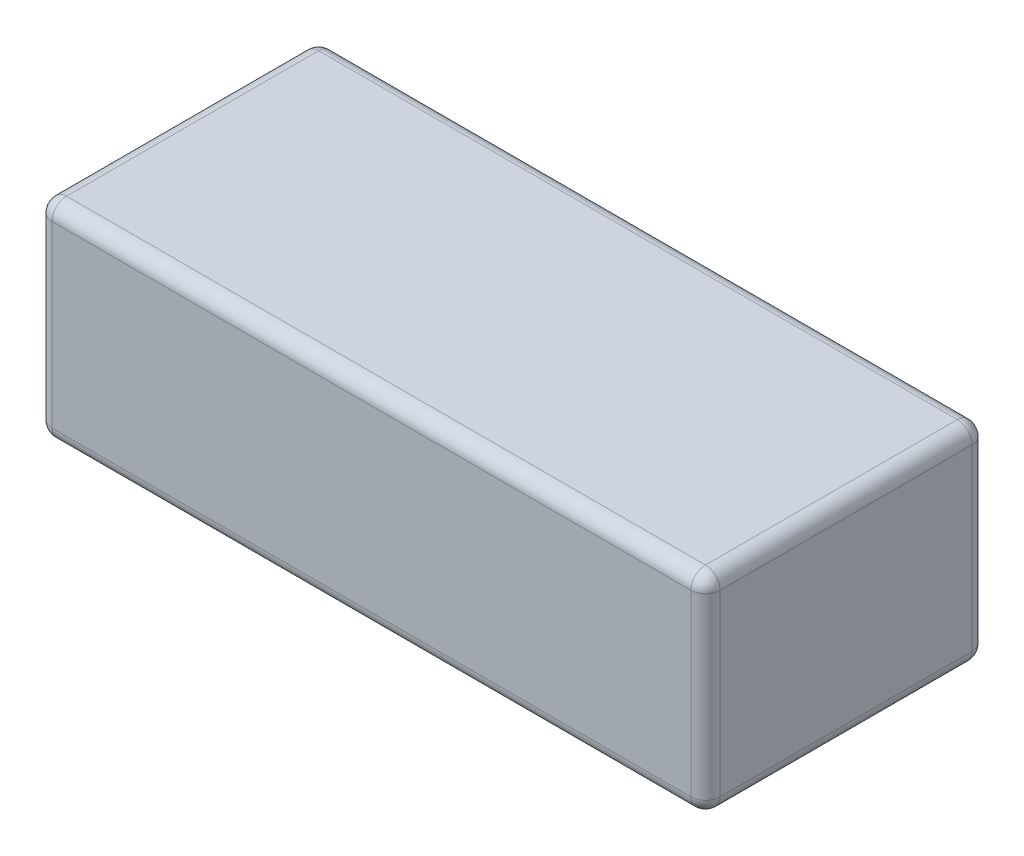
ISO-10303-21;
HEADER;
FILE_DESCRIPTION(('STEP AP214'),'2;1');
FILE_NAME('part.step','',(''),(''),'','','');
FILE_SCHEMA(('AUTOMOTIVE_DESIGN { 1 0 10303 214 1 1 1 1 }'));
ENDSEC;
DATA;
#1=APPLICATION_CONTEXT('core data for automotive mechanical design processes');
#2=APPLICATION_PROTOCOL_DEFINITION('international standard','automotive_design',2000,#1);
#3=PRODUCT_CONTEXT('',#1,'mechanical');
#4=PRODUCT('Part','Part','',(#3));
#5=PRODUCT_RELATED_PRODUCT_CATEGORY('part','',(#4));
#6=PRODUCT_DEFINITION_FORMATION('','',#4);
#7=PRODUCT_DEFINITION_CONTEXT('part definition',#1,'design');
#8=PRODUCT_DEFINITION('design','',#6,#7);
#9=PRODUCT_DEFINITION_SHAPE('','',#8);
#10=(LENGTH_UNIT() NAMED_UNIT(*) SI_UNIT(.MILLI.,.METRE.));
#11=(NAMED_UNIT(*) PLANE_ANGLE_UNIT() SI_UNIT($,.RADIAN.));
#12=(NAMED_UNIT(*) SI_UNIT($,.STERADIAN.) SOLID_ANGLE_UNIT());
#13=UNCERTAINTY_MEASURE_WITH_UNIT(LENGTH_MEASURE(1.E-05),#10,'distance_accuracy_value','');
#14=(GEOMETRIC_REPRESENTATION_CONTEXT(3) GLOBAL_UNCERTAINTY_ASSIGNED_CONTEXT((#13)) GLOBAL_UNIT_ASSIGNED_CONTEXT((#10,
#11,#12)) REPRESENTATION_CONTEXT('',''));
#15=CARTESIAN_POINT('',(0.,0.,0.));
#16=DIRECTION('',(0.,0.,1.));
#17=DIRECTION('',(1.,0.,0.));
#18=AXIS2_PLACEMENT_3D('',#15,#16,#17);
#19=CARTESIAN_POINT('',(-197.218045112782,57.,-62.6052631578947));
#20=DIRECTION('',(1.,0.,0.));
#21=DIRECTION('',(0.,0.,-1.));
#22=AXIS2_PLACEMENT_3D('',#19,#20,#21);
#23=PLANE('',#22);
#24=DIRECTION('',(0.,-1.,0.));
#25=VECTOR('',#24,1.);
#26=CARTESIAN_POINT('',(-197.218045112782,57.,-58.6052631578947));
#27=LINE('',#26,#25);
#28=CARTESIAN_POINT('',(-197.218045112782,53.,-58.6052631578947));
#29=VERTEX_POINT('',#28);
#30=CARTESIAN_POINT('',(-197.218045112782,4.,-58.6052631578947));
#31=VERTEX_POINT('',#30);
#32=EDGE_CURVE('E198',#29,#31,#27,.T.);
#33=ORIENTED_EDGE('',*,*,#32,.T.);
#34=DIRECTION('',(0.,0.,1.));
#35=VECTOR('',#34,1.);
#36=CARTESIAN_POINT('',(-197.218045112782,4.,-62.6052631578947));
#37=LINE('',#36,#35);
#38=CARTESIAN_POINT('',(-197.218045112782,4.,10.3947368421053));
#39=VERTEX_POINT('',#38);
#40=EDGE_CURVE('E205',#31,#39,#37,.T.);
#41=ORIENTED_EDGE('',*,*,#40,.T.);
#42=DIRECTION('',(0.,-1.,0.));
#43=VECTOR('',#42,1.);
#44=CARTESIAN_POINT('',(-197.218045112782,57.,10.3947368421053));
#45=LINE('',#44,#43);
#46=CARTESIAN_POINT('',(-197.218045112782,53.,10.3947368421053));
#47=VERTEX_POINT('',#46);
#48=EDGE_CURVE('E201',#39,#47,#45,.F.);
#49=ORIENTED_EDGE('',*,*,#48,.T.);
#50=DIRECTION('',(0.,0.,1.));
#51=VECTOR('',#50,1.);
#52=CARTESIAN_POINT('',(-197.218045112782,53.,-62.6052631578947));
#53=LINE('',#52,#51);
#54=EDGE_CURVE('E195',#47,#29,#53,.F.);
#55=ORIENTED_EDGE('',*,*,#54,.T.);
#56=EDGE_LOOP('',(#33,#41,#49,#55));
#57=FACE_BOUND('',#56,.T.);
#58=ADVANCED_FACE('F40',(#57),#23,.F.);
#59=CARTESIAN_POINT('',(-197.218045112782,57.,14.3947368421053));
#60=DIRECTION('',(0.,0.,-1.));
#61=DIRECTION('',(-1.,0.,0.));
#62=AXIS2_PLACEMENT_3D('',#59,#60,#61);
#63=PLANE('',#62);
#64=DIRECTION('',(0.,-1.,0.));
#65=VECTOR('',#64,1.);
#66=CARTESIAN_POINT('',(-193.218045112782,57.,14.3947368421053));
#67=LINE('',#66,#65);
#68=CARTESIAN_POINT('',(-193.218045112782,53.,14.3947368421053));
#69=VERTEX_POINT('',#68);
#70=CARTESIAN_POINT('',(-193.218045112782,4.,14.3947368421053));
#71=VERTEX_POINT('',#70);
#72=EDGE_CURVE('E185',#69,#71,#67,.T.);
#73=ORIENTED_EDGE('',*,*,#72,.T.);
#74=DIRECTION('',(1.,0.,0.));
#75=VECTOR('',#74,1.);
#76=CARTESIAN_POINT('',(-197.218045112782,4.,14.3947368421053));
#77=LINE('',#76,#75);
#78=CARTESIAN_POINT('',(-18.2180451127819,4.,14.3947368421053));
#79=VERTEX_POINT('',#78);
#80=EDGE_CURVE('E192',#71,#79,#77,.T.);
#81=ORIENTED_EDGE('',*,*,#80,.T.);
#82=DIRECTION('',(0.,-1.,0.));
#83=VECTOR('',#82,1.);
#84=CARTESIAN_POINT('',(-18.2180451127819,57.,14.3947368421053));
#85=LINE('',#84,#83);
#86=CARTESIAN_POINT('',(-18.2180451127819,53.,14.3947368421053));
#87=VERTEX_POINT('',#86);
#88=EDGE_CURVE('E188',#79,#87,#85,.F.);
#89=ORIENTED_EDGE('',*,*,#88,.T.);
#90=DIRECTION('',(1.,0.,0.));
#91=VECTOR('',#90,1.);
#92=CARTESIAN_POINT('',(-197.218045112782,53.,14.3947368421053));
#93=LINE('',#92,#91);
#94=EDGE_CURVE('E182',#87,#69,#93,.F.);
#95=ORIENTED_EDGE('',*,*,#94,.T.);
#96=EDGE_LOOP('',(#73,#81,#89,#95));
#97=FACE_BOUND('',#96,.T.);
#98=ADVANCED_FACE('F363',(#97),#63,.F.);
#99=CARTESIAN_POINT('',(-14.2180451127819,57.,-62.6052631578947));
#100=DIRECTION('',(-1.,0.,0.));
#101=DIRECTION('',(0.,0.,1.));
#102=AXIS2_PLACEMENT_3D('',#99,#100,#101);
#103=PLANE('',#102);
#104=DIRECTION('',(0.,-1.,0.));
#105=VECTOR('',#104,1.);
#106=CARTESIAN_POINT('',(-14.2180451127819,57.,10.3947368421053));
#107=LINE('',#106,#105);
#108=CARTESIAN_POINT('',(-14.2180451127819,53.,10.3947368421053));
#109=VERTEX_POINT('',#108);
#110=CARTESIAN_POINT('',(-14.2180451127819,4.,10.3947368421053));
#111=VERTEX_POINT('',#110);
#112=EDGE_CURVE('E141',#109,#111,#107,.T.);
#113=ORIENTED_EDGE('',*,*,#112,.T.);
#114=DIRECTION('',(0.,0.,-1.));
#115=VECTOR('',#114,1.);
#116=CARTESIAN_POINT('',(-14.2180451127819,4.,-62.6052631578947));
#117=LINE('',#116,#115);
#118=CARTESIAN_POINT('',(-14.2180451127819,4.,-58.6052631578947));
#119=VERTEX_POINT('',#118);
#120=EDGE_CURVE('E136',#111,#119,#117,.T.);
#121=ORIENTED_EDGE('',*,*,#120,.T.);
#122=DIRECTION('',(0.,-1.,0.));
#123=VECTOR('',#122,1.);
#124=CARTESIAN_POINT('',(-14.2180451127819,57.,-58.6052631578947));
#125=LINE('',#124,#123);
#126=CARTESIAN_POINT('',(-14.2180451127819,53.,-58.6052631578947));
#127=VERTEX_POINT('',#126);
#128=EDGE_CURVE('E128',#119,#127,#125,.F.);
#129=ORIENTED_EDGE('',*,*,#128,.T.);
#130=DIRECTION('',(0.,0.,-1.));
#131=VECTOR('',#130,1.);
#132=CARTESIAN_POINT('',(-14.2180451127819,53.,14.3947368421053));
#133=LINE('',#132,#131);
#134=EDGE_CURVE('E133',#127,#109,#133,.F.);
#135=ORIENTED_EDGE('',*,*,#134,.T.);
#136=EDGE_LOOP('',(#113,#121,#129,#135));
#137=FACE_BOUND('',#136,.T.);
#138=ADVANCED_FACE('F131',(#137),#103,.F.);
#139=CARTESIAN_POINT('',(-197.218045112782,57.,-62.6052631578947));
#140=DIRECTION('',(0.,0.,1.));
#141=DIRECTION('',(1.,0.,0.));
#142=AXIS2_PLACEMENT_3D('',#139,#140,#141);
#143=PLANE('',#142);
#144=DIRECTION('',(0.,-1.,0.));
#145=VECTOR('',#144,1.);
#146=CARTESIAN_POINT('',(-18.218045112782,57.,-62.6052631578947));
#147=LINE('',#146,#145);
#148=CARTESIAN_POINT('',(-18.218045112782,53.,-62.6052631578947));
#149=VERTEX_POINT('',#148);
#150=CARTESIAN_POINT('',(-18.218045112782,4.,-62.6052631578947));
#151=VERTEX_POINT('',#150);
#152=EDGE_CURVE('E149',#149,#151,#147,.T.);
#153=ORIENTED_EDGE('',*,*,#152,.T.);
#154=DIRECTION('',(-1.,0.,0.));
#155=VECTOR('',#154,1.);
#156=CARTESIAN_POINT('',(-197.218045112782,4.,-62.6052631578947));
#157=LINE('',#156,#155);
#158=CARTESIAN_POINT('',(-193.218045112782,4.,-62.6052631578947));
#159=VERTEX_POINT('',#158);
#160=EDGE_CURVE('E216',#151,#159,#157,.T.);
#161=ORIENTED_EDGE('',*,*,#160,.T.);
#162=DIRECTION('',(0.,-1.,0.));
#163=VECTOR('',#162,1.);
#164=CARTESIAN_POINT('',(-193.218045112782,57.,-62.6052631578947));
#165=LINE('',#164,#163);
#166=CARTESIAN_POINT('',(-193.218045112782,53.,-62.6052631578947));
#167=VERTEX_POINT('',#166);
#168=EDGE_CURVE('E211',#159,#167,#165,.F.);
#169=ORIENTED_EDGE('',*,*,#168,.T.);
#170=DIRECTION('',(-1.,0.,0.));
#171=VECTOR('',#170,1.);
#172=CARTESIAN_POINT('',(-14.2180451127819,53.,-62.6052631578947));
#173=LINE('',#172,#171);
#174=EDGE_CURVE('E208',#167,#149,#173,.F.);
#175=ORIENTED_EDGE('',*,*,#174,.T.);
#176=EDGE_LOOP('',(#153,#161,#169,#175));
#177=FACE_BOUND('',#176,.T.);
#178=ADVANCED_FACE('F354',(#177),#143,.F.);
#179=CARTESIAN_POINT('',(0.,57.,0.));
#180=DIRECTION('',(0.,1.,0.));
#181=DIRECTION('',(0.,0.,1.));
#182=AXIS2_PLACEMENT_3D('',#179,#180,#181);
#183=PLANE('',#182);
#184=DIRECTION('',(0.,0.,-1.));
#185=VECTOR('',#184,1.);
#186=CARTESIAN_POINT('',(-18.2180451127819,57.,-62.6052631578947));
#187=LINE('',#186,#185);
#188=CARTESIAN_POINT('',(-18.2180451127819,57.,10.3947368421053));
#189=VERTEX_POINT('',#188);
#190=CARTESIAN_POINT('',(-18.2180451127819,57.,-58.6052631578947));
#191=VERTEX_POINT('',#190);
#192=EDGE_CURVE('E50',#189,#191,#187,.T.);
#193=ORIENTED_EDGE('',*,*,#192,.T.);
#194=DIRECTION('',(-1.,0.,0.));
#195=VECTOR('',#194,1.);
#196=CARTESIAN_POINT('',(-197.218045112782,57.,-58.6052631578947));
#197=LINE('',#196,#195);
#198=CARTESIAN_POINT('',(-193.218045112782,57.,-58.6052631578947));
#199=VERTEX_POINT('',#198);
#200=EDGE_CURVE('E11',#191,#199,#197,.T.);
#201=ORIENTED_EDGE('',*,*,#200,.T.);
#202=DIRECTION('',(0.,0.,1.));
#203=VECTOR('',#202,1.);
#204=CARTESIAN_POINT('',(-193.218045112782,57.,14.3947368421053));
#205=LINE('',#204,#203);
#206=CARTESIAN_POINT('',(-193.218045112782,57.,10.3947368421053));
#207=VERTEX_POINT('',#206);
#208=EDGE_CURVE('E232',#199,#207,#205,.T.);
#209=ORIENTED_EDGE('',*,*,#208,.T.);
#210=DIRECTION('',(1.,0.,0.));
#211=VECTOR('',#210,1.);
#212=CARTESIAN_POINT('',(-14.2180451127819,57.,10.3947368421053));
#213=LINE('',#212,#211);
#214=EDGE_CURVE('E61',#207,#189,#213,.T.);
#215=ORIENTED_EDGE('',*,*,#214,.T.);
#216=EDGE_LOOP('',(#193,#201,#209,#215));
#217=FACE_BOUND('',#216,.T.);
#218=ADVANCED_FACE('F356',(#217),#183,.T.);
#219=CARTESIAN_POINT('',(0.,0.,0.));
#220=DIRECTION('',(0.,1.,0.));
#221=DIRECTION('',(0.,0.,1.));
#222=AXIS2_PLACEMENT_3D('',#219,#220,#221);
#223=PLANE('',#222);
#224=DIRECTION('',(0.,0.,-1.));
#225=VECTOR('',#224,1.);
#226=CARTESIAN_POINT('',(-18.2180451127819,0.,0.));
#227=LINE('',#226,#225);
#228=CARTESIAN_POINT('',(-18.2180451127819,0.,-58.6052631578947));
#229=VERTEX_POINT('',#228);
#230=CARTESIAN_POINT('',(-18.2180451127819,0.,10.3947368421053));
#231=VERTEX_POINT('',#230);
#232=EDGE_CURVE('E225',#229,#231,#227,.F.);
#233=ORIENTED_EDGE('',*,*,#232,.T.);
#234=DIRECTION('',(1.,0.,0.));
#235=VECTOR('',#234,1.);
#236=CARTESIAN_POINT('',(0.,0.,10.3947368421053));
#237=LINE('',#236,#235);
#238=CARTESIAN_POINT('',(-193.218045112782,0.,10.3947368421053));
#239=VERTEX_POINT('',#238);
#240=EDGE_CURVE('E228',#231,#239,#237,.F.);
#241=ORIENTED_EDGE('',*,*,#240,.T.);
#242=DIRECTION('',(0.,0.,1.));
#243=VECTOR('',#242,1.);
#244=CARTESIAN_POINT('',(-193.218045112782,0.,0.));
#245=LINE('',#244,#243);
#246=CARTESIAN_POINT('',(-193.218045112782,0.,-58.6052631578947));
#247=VERTEX_POINT('',#246);
#248=EDGE_CURVE('E219',#239,#247,#245,.F.);
#249=ORIENTED_EDGE('',*,*,#248,.T.);
#250=DIRECTION('',(-1.,0.,0.));
#251=VECTOR('',#250,1.);
#252=CARTESIAN_POINT('',(0.,0.,-58.6052631578947));
#253=LINE('',#252,#251);
#254=EDGE_CURVE('E222',#247,#229,#253,.F.);
#255=ORIENTED_EDGE('',*,*,#254,.T.);
#256=EDGE_LOOP('',(#233,#241,#249,#255));
#257=FACE_BOUND('',#256,.T.);
#258=ADVANCED_FACE('F324',(#257),#223,.F.);
#259=CARTESIAN_POINT('',(-193.218045112782,57.,-58.6052631578947));
#260=DIRECTION('',(0.,-1.,0.));
#261=DIRECTION('',(0.,0.,-1.));
#262=AXIS2_PLACEMENT_3D('',#259,#260,#261);
#263=CYLINDRICAL_SURFACE('',#262,4.);
#264=CARTESIAN_POINT('',(-193.218045112782,53.,-58.6052631578947));
#265=DIRECTION('',(0.,1.,0.));
#266=DIRECTION('',(0.,0.,1.));
#267=AXIS2_PLACEMENT_3D('',#264,#265,#266);
#268=CIRCLE('',#267,4.);
#269=EDGE_CURVE('E44',#167,#29,#268,.T.);
#270=ORIENTED_EDGE('',*,*,#269,.F.);
#271=ORIENTED_EDGE('',*,*,#168,.F.);
#272=CARTESIAN_POINT('',(-193.218045112782,4.,-58.6052631578947));
#273=DIRECTION('',(0.,-1.,0.));
#274=DIRECTION('',(0.,0.,-1.));
#275=AXIS2_PLACEMENT_3D('',#272,#273,#274);
#276=CIRCLE('',#275,4.);
#277=EDGE_CURVE('E173',#31,#159,#276,.T.);
#278=ORIENTED_EDGE('',*,*,#277,.F.);
#279=ORIENTED_EDGE('',*,*,#32,.F.);
#280=EDGE_LOOP('',(#270,#271,#278,#279));
#281=FACE_BOUND('',#280,.T.);
#282=ADVANCED_FACE('F42',(#281),#263,.T.);
#283=CARTESIAN_POINT('',(-193.218045112782,53.,-58.6052631578947));
#284=DIRECTION('',(0.,0.,1.));
#285=DIRECTION('',(1.,0.,0.));
#286=AXIS2_PLACEMENT_3D('',#283,#284,#285);
#287=SPHERICAL_SURFACE('',#286,4.);
#288=CARTESIAN_POINT('',(-193.218045112782,53.,-58.6052631578947));
#289=DIRECTION('',(-1.,0.,0.));
#290=DIRECTION('',(0.,0.,1.));
#291=AXIS2_PLACEMENT_3D('',#288,#289,#290);
#292=CIRCLE('',#291,4.);
#293=EDGE_CURVE('E299',#167,#199,#292,.F.);
#294=ORIENTED_EDGE('',*,*,#293,.F.);
#295=ORIENTED_EDGE('',*,*,#269,.T.);
#296=CARTESIAN_POINT('',(-193.218045112782,53.,-58.6052631578947));
#297=DIRECTION('',(0.,0.,-1.));
#298=DIRECTION('',(-1.,0.,0.));
#299=AXIS2_PLACEMENT_3D('',#296,#297,#298);
#300=CIRCLE('',#299,4.);
#301=EDGE_CURVE('E303',#199,#29,#300,.F.);
#302=ORIENTED_EDGE('',*,*,#301,.F.);
#303=EDGE_LOOP('',(#294,#295,#302));
#304=FACE_BOUND('',#303,.T.);
#305=ADVANCED_FACE('F349',(#304),#287,.T.);
#306=CARTESIAN_POINT('',(-193.218045112782,4.,-58.6052631578947));
#307=DIRECTION('',(0.,0.,1.));
#308=DIRECTION('',(1.,0.,0.));
#309=AXIS2_PLACEMENT_3D('',#306,#307,#308);
#310=SPHERICAL_SURFACE('',#309,4.);
#311=CARTESIAN_POINT('',(-193.218045112782,4.,-58.6052631578947));
#312=DIRECTION('',(0.,0.,-1.));
#313=DIRECTION('',(-1.,0.,0.));
#314=AXIS2_PLACEMENT_3D('',#311,#312,#313);
#315=CIRCLE('',#314,4.);
#316=EDGE_CURVE('E291',#31,#247,#315,.F.);
#317=ORIENTED_EDGE('',*,*,#316,.F.);
#318=ORIENTED_EDGE('',*,*,#277,.T.);
#319=CARTESIAN_POINT('',(-193.218045112782,4.,-58.6052631578947));
#320=DIRECTION('',(-1.,0.,0.));
#321=DIRECTION('',(0.,0.,1.));
#322=AXIS2_PLACEMENT_3D('',#319,#320,#321);
#323=CIRCLE('',#322,4.);
#324=EDGE_CURVE('E295',#247,#159,#323,.F.);
#325=ORIENTED_EDGE('',*,*,#324,.F.);
#326=EDGE_LOOP('',(#317,#318,#325));
#327=FACE_BOUND('',#326,.T.);
#328=ADVANCED_FACE('F312',(#327),#310,.T.);
#329=CARTESIAN_POINT('',(-193.218045112782,53.,0.));
#330=DIRECTION('',(0.,0.,-1.));
#331=DIRECTION('',(-1.,0.,0.));
#332=AXIS2_PLACEMENT_3D('',#329,#330,#331);
#333=CYLINDRICAL_SURFACE('',#332,4.);
#334=ORIENTED_EDGE('',*,*,#301,.T.);
#335=ORIENTED_EDGE('',*,*,#54,.F.);
#336=CARTESIAN_POINT('',(-193.218045112782,53.,10.3947368421053));
#337=DIRECTION('',(0.,0.,1.));
#338=DIRECTION('',(1.,0.,0.));
#339=AXIS2_PLACEMENT_3D('',#336,#337,#338);
#340=CIRCLE('',#339,4.);
#341=EDGE_CURVE('E284',#207,#47,#340,.T.);
#342=ORIENTED_EDGE('',*,*,#341,.F.);
#343=ORIENTED_EDGE('',*,*,#208,.F.);
#344=EDGE_LOOP('',(#334,#335,#342,#343));
#345=FACE_BOUND('',#344,.T.);
#346=ADVANCED_FACE('F344',(#345),#333,.T.);
#347=CARTESIAN_POINT('',(0.,53.,-58.6052631578947));
#348=DIRECTION('',(1.,0.,0.));
#349=DIRECTION('',(0.,0.,-1.));
#350=AXIS2_PLACEMENT_3D('',#347,#348,#349);
#351=CYLINDRICAL_SURFACE('',#350,4.);
#352=ORIENTED_EDGE('',*,*,#293,.T.);
#353=ORIENTED_EDGE('',*,*,#200,.F.);
#354=CARTESIAN_POINT('',(-18.218045112782,53.,-58.6052631578947));
#355=DIRECTION('',(1.,0.,0.));
#356=DIRECTION('',(0.,1.,0.));
#357=AXIS2_PLACEMENT_3D('',#354,#355,#356);
#358=CIRCLE('',#357,4.);
#359=EDGE_CURVE('E154',#149,#191,#358,.T.);
#360=ORIENTED_EDGE('',*,*,#359,.F.);
#361=ORIENTED_EDGE('',*,*,#174,.F.);
#362=EDGE_LOOP('',(#352,#353,#360,#361));
#363=FACE_BOUND('',#362,.T.);
#364=ADVANCED_FACE('F352',(#363),#351,.T.);
#365=CARTESIAN_POINT('',(-18.218045112782,57.,-58.6052631578947));
#366=DIRECTION('',(0.,-1.,0.));
#367=DIRECTION('',(0.,0.,-1.));
#368=AXIS2_PLACEMENT_3D('',#365,#366,#367);
#369=CYLINDRICAL_SURFACE('',#368,4.);
#370=CARTESIAN_POINT('',(-18.218045112782,4.,-58.6052631578947));
#371=DIRECTION('',(0.,-1.,0.));
#372=DIRECTION('',(0.,0.,-1.));
#373=AXIS2_PLACEMENT_3D('',#370,#371,#372);
#374=CIRCLE('',#373,4.);
#375=EDGE_CURVE('E155',#151,#119,#374,.T.);
#376=ORIENTED_EDGE('',*,*,#375,.F.);
#377=ORIENTED_EDGE('',*,*,#152,.F.);
#378=CARTESIAN_POINT('',(-18.2180451127819,53.,-58.6052631578947));
#379=DIRECTION('',(0.,1.,0.));
#380=DIRECTION('',(0.,0.,1.));
#381=AXIS2_PLACEMENT_3D('',#378,#379,#380);
#382=CIRCLE('',#381,4.);
#383=EDGE_CURVE('E145',#127,#149,#382,.T.);
#384=ORIENTED_EDGE('',*,*,#383,.F.);
#385=ORIENTED_EDGE('',*,*,#128,.F.);
#386=EDGE_LOOP('',(#376,#377,#384,#385));
#387=FACE_BOUND('',#386,.T.);
#388=ADVANCED_FACE('F147',(#387),#369,.T.);
#389=CARTESIAN_POINT('',(-197.218045112782,4.,-58.6052631578947));
#390=DIRECTION('',(-1.,0.,0.));
#391=DIRECTION('',(0.,0.,1.));
#392=AXIS2_PLACEMENT_3D('',#389,#390,#391);
#393=CYLINDRICAL_SURFACE('',#392,4.);
#394=ORIENTED_EDGE('',*,*,#324,.T.);
#395=ORIENTED_EDGE('',*,*,#160,.F.);
#396=CARTESIAN_POINT('',(-18.2180451127819,4.,-58.6052631578947));
#397=DIRECTION('',(1.,0.,0.));
#398=DIRECTION('',(0.,0.,-1.));
#399=AXIS2_PLACEMENT_3D('',#396,#397,#398);
#400=CIRCLE('',#399,4.);
#401=EDGE_CURVE('E277',#229,#151,#400,.T.);
#402=ORIENTED_EDGE('',*,*,#401,.F.);
#403=ORIENTED_EDGE('',*,*,#254,.F.);
#404=EDGE_LOOP('',(#394,#395,#402,#403));
#405=FACE_BOUND('',#404,.T.);
#406=ADVANCED_FACE('F320',(#405),#393,.T.);
#407=CARTESIAN_POINT('',(-193.218045112782,4.,-62.6052631578947));
#408=DIRECTION('',(0.,0.,1.));
#409=DIRECTION('',(1.,0.,0.));
#410=AXIS2_PLACEMENT_3D('',#407,#408,#409);
#411=CYLINDRICAL_SURFACE('',#410,4.);
#412=ORIENTED_EDGE('',*,*,#316,.T.);
#413=ORIENTED_EDGE('',*,*,#248,.F.);
#414=CARTESIAN_POINT('',(-193.218045112782,4.,10.3947368421053));
#415=DIRECTION('',(0.,0.,1.));
#416=DIRECTION('',(1.,0.,0.));
#417=AXIS2_PLACEMENT_3D('',#414,#415,#416);
#418=CIRCLE('',#417,4.);
#419=EDGE_CURVE('E273',#39,#239,#418,.T.);
#420=ORIENTED_EDGE('',*,*,#419,.F.);
#421=ORIENTED_EDGE('',*,*,#40,.F.);
#422=EDGE_LOOP('',(#412,#413,#420,#421));
#423=FACE_BOUND('',#422,.T.);
#424=ADVANCED_FACE('F330',(#423),#411,.T.);
#425=CARTESIAN_POINT('',(-193.218045112782,57.,10.3947368421053));
#426=DIRECTION('',(0.,-1.,0.));
#427=DIRECTION('',(0.,0.,-1.));
#428=AXIS2_PLACEMENT_3D('',#425,#426,#427);
#429=CYLINDRICAL_SURFACE('',#428,4.);
#430=CARTESIAN_POINT('',(-193.218045112782,53.,10.3947368421053));
#431=DIRECTION('',(0.,1.,0.));
#432=DIRECTION('',(0.,0.,1.));
#433=AXIS2_PLACEMENT_3D('',#430,#431,#432);
#434=CIRCLE('',#433,4.);
#435=EDGE_CURVE('E287',#47,#69,#434,.T.);
#436=ORIENTED_EDGE('',*,*,#435,.F.);
#437=ORIENTED_EDGE('',*,*,#48,.F.);
#438=CARTESIAN_POINT('',(-193.218045112782,4.,10.3947368421053));
#439=DIRECTION('',(0.,-1.,0.));
#440=DIRECTION('',(0.,0.,-1.));
#441=AXIS2_PLACEMENT_3D('',#438,#439,#440);
#442=CIRCLE('',#441,4.);
#443=EDGE_CURVE('E269',#71,#39,#442,.T.);
#444=ORIENTED_EDGE('',*,*,#443,.F.);
#445=ORIENTED_EDGE('',*,*,#72,.F.);
#446=EDGE_LOOP('',(#436,#437,#444,#445));
#447=FACE_BOUND('',#446,.T.);
#448=ADVANCED_FACE('F336',(#447),#429,.T.);
#449=CARTESIAN_POINT('',(-193.218045112782,53.,10.3947368421053));
#450=DIRECTION('',(0.,0.,1.));
#451=DIRECTION('',(1.,0.,0.));
#452=AXIS2_PLACEMENT_3D('',#449,#450,#451);
#453=SPHERICAL_SURFACE('',#452,4.);
#454=ORIENTED_EDGE('',*,*,#341,.T.);
#455=ORIENTED_EDGE('',*,*,#435,.T.);
#456=CARTESIAN_POINT('',(-193.218045112782,53.,10.3947368421053));
#457=DIRECTION('',(-1.,0.,0.));
#458=DIRECTION('',(0.,0.,1.));
#459=AXIS2_PLACEMENT_3D('',#456,#457,#458);
#460=CIRCLE('',#459,4.);
#461=EDGE_CURVE('E162',#207,#69,#460,.F.);
#462=ORIENTED_EDGE('',*,*,#461,.F.);
#463=EDGE_LOOP('',(#454,#455,#462));
#464=FACE_BOUND('',#463,.T.);
#465=ADVANCED_FACE('F410',(#464),#453,.T.);
#466=CARTESIAN_POINT('',(-18.2180451127819,53.,-58.6052631578947));
#467=DIRECTION('',(0.,0.,1.));
#468=DIRECTION('',(1.,0.,0.));
#469=AXIS2_PLACEMENT_3D('',#466,#467,#468);
#470=SPHERICAL_SURFACE('',#469,4.);
#471=ORIENTED_EDGE('',*,*,#383,.T.);
#472=ORIENTED_EDGE('',*,*,#359,.T.);
#473=CARTESIAN_POINT('',(-18.2180451127819,53.,-58.6052631578947));
#474=DIRECTION('',(0.,0.,-1.));
#475=DIRECTION('',(-1.,0.,0.));
#476=AXIS2_PLACEMENT_3D('',#473,#474,#475);
#477=CIRCLE('',#476,4.);
#478=EDGE_CURVE('E158',#127,#191,#477,.F.);
#479=ORIENTED_EDGE('',*,*,#478,.F.);
#480=EDGE_LOOP('',(#471,#472,#479));
#481=FACE_BOUND('',#480,.T.);
#482=ADVANCED_FACE('F159',(#481),#470,.T.);
#483=CARTESIAN_POINT('',(-18.2180451127819,4.,-58.6052631578947));
#484=DIRECTION('',(0.,0.,1.));
#485=DIRECTION('',(1.,0.,0.));
#486=AXIS2_PLACEMENT_3D('',#483,#484,#485);
#487=SPHERICAL_SURFACE('',#486,4.);
#488=ORIENTED_EDGE('',*,*,#401,.T.);
#489=ORIENTED_EDGE('',*,*,#375,.T.);
#490=CARTESIAN_POINT('',(-18.2180451127819,4.,-58.6052631578947));
#491=DIRECTION('',(0.,0.,-1.));
#492=DIRECTION('',(-1.,0.,0.));
#493=AXIS2_PLACEMENT_3D('',#490,#491,#492);
#494=CIRCLE('',#493,4.);
#495=EDGE_CURVE('E163',#229,#119,#494,.F.);
#496=ORIENTED_EDGE('',*,*,#495,.F.);
#497=EDGE_LOOP('',(#488,#489,#496));
#498=FACE_BOUND('',#497,.T.);
#499=ADVANCED_FACE('F403',(#498),#487,.T.);
#500=CARTESIAN_POINT('',(-193.218045112782,4.,10.3947368421053));
#501=DIRECTION('',(0.,0.,1.));
#502=DIRECTION('',(1.,0.,0.));
#503=AXIS2_PLACEMENT_3D('',#500,#501,#502);
#504=SPHERICAL_SURFACE('',#503,4.);
#505=ORIENTED_EDGE('',*,*,#443,.T.);
#506=ORIENTED_EDGE('',*,*,#419,.T.);
#507=CARTESIAN_POINT('',(-193.218045112782,4.,10.3947368421053));
#508=DIRECTION('',(-1.,0.,0.));
#509=DIRECTION('',(0.,0.,1.));
#510=AXIS2_PLACEMENT_3D('',#507,#508,#509);
#511=CIRCLE('',#510,4.);
#512=EDGE_CURVE('E260',#71,#239,#511,.F.);
#513=ORIENTED_EDGE('',*,*,#512,.F.);
#514=EDGE_LOOP('',(#505,#506,#513));
#515=FACE_BOUND('',#514,.T.);
#516=ADVANCED_FACE('F399',(#515),#504,.T.);
#517=CARTESIAN_POINT('',(0.,53.,10.3947368421053));
#518=DIRECTION('',(-1.,0.,0.));
#519=DIRECTION('',(0.,0.,1.));
#520=AXIS2_PLACEMENT_3D('',#517,#518,#519);
#521=CYLINDRICAL_SURFACE('',#520,4.);
#522=ORIENTED_EDGE('',*,*,#461,.T.);
#523=ORIENTED_EDGE('',*,*,#94,.F.);
#524=CARTESIAN_POINT('',(-18.2180451127819,53.,10.3947368421053));
#525=DIRECTION('',(1.,0.,0.));
#526=DIRECTION('',(0.,0.,-1.));
#527=AXIS2_PLACEMENT_3D('',#524,#525,#526);
#528=CIRCLE('',#527,4.);
#529=EDGE_CURVE('E256',#189,#87,#528,.T.);
#530=ORIENTED_EDGE('',*,*,#529,.F.);
#531=ORIENTED_EDGE('',*,*,#214,.F.);
#532=EDGE_LOOP('',(#522,#523,#530,#531));
#533=FACE_BOUND('',#532,.T.);
#534=ADVANCED_FACE('F396',(#533),#521,.T.);
#535=CARTESIAN_POINT('',(-18.2180451127819,53.,0.));
#536=DIRECTION('',(0.,0.,1.));
#537=DIRECTION('',(1.,0.,0.));
#538=AXIS2_PLACEMENT_3D('',#535,#536,#537);
#539=CYLINDRICAL_SURFACE('',#538,4.);
#540=ORIENTED_EDGE('',*,*,#478,.T.);
#541=ORIENTED_EDGE('',*,*,#192,.F.);
#542=CARTESIAN_POINT('',(-18.2180451127819,53.,10.3947368421053));
#543=DIRECTION('',(0.,0.,1.));
#544=DIRECTION('',(0.,-1.,0.));
#545=AXIS2_PLACEMENT_3D('',#542,#543,#544);
#546=CIRCLE('',#545,4.);
#547=EDGE_CURVE('E167',#109,#189,#546,.T.);
#548=ORIENTED_EDGE('',*,*,#547,.F.);
#549=ORIENTED_EDGE('',*,*,#134,.F.);
#550=EDGE_LOOP('',(#540,#541,#548,#549));
#551=FACE_BOUND('',#550,.T.);
#552=ADVANCED_FACE('F165',(#551),#539,.T.);
#553=CARTESIAN_POINT('',(-18.2180451127819,4.,-62.6052631578947));
#554=DIRECTION('',(0.,0.,-1.));
#555=DIRECTION('',(-1.,0.,0.));
#556=AXIS2_PLACEMENT_3D('',#553,#554,#555);
#557=CYLINDRICAL_SURFACE('',#556,4.);
#558=ORIENTED_EDGE('',*,*,#495,.T.);
#559=ORIENTED_EDGE('',*,*,#120,.F.);
#560=CARTESIAN_POINT('',(-18.2180451127819,4.,10.3947368421053));
#561=DIRECTION('',(0.,0.,1.));
#562=DIRECTION('',(1.,0.,0.));
#563=AXIS2_PLACEMENT_3D('',#560,#561,#562);
#564=CIRCLE('',#563,4.);
#565=EDGE_CURVE('E250',#231,#111,#564,.T.);
#566=ORIENTED_EDGE('',*,*,#565,.F.);
#567=ORIENTED_EDGE('',*,*,#232,.F.);
#568=EDGE_LOOP('',(#558,#559,#566,#567));
#569=FACE_BOUND('',#568,.T.);
#570=ADVANCED_FACE('F389',(#569),#557,.T.);
#571=CARTESIAN_POINT('',(-197.218045112782,4.,10.3947368421053));
#572=DIRECTION('',(1.,0.,0.));
#573=DIRECTION('',(0.,0.,-1.));
#574=AXIS2_PLACEMENT_3D('',#571,#572,#573);
#575=CYLINDRICAL_SURFACE('',#574,4.);
#576=ORIENTED_EDGE('',*,*,#512,.T.);
#577=ORIENTED_EDGE('',*,*,#240,.F.);
#578=CARTESIAN_POINT('',(-18.2180451127819,4.,10.3947368421053));
#579=DIRECTION('',(1.,0.,0.));
#580=DIRECTION('',(0.,0.,-1.));
#581=AXIS2_PLACEMENT_3D('',#578,#579,#580);
#582=CIRCLE('',#581,4.);
#583=EDGE_CURVE('E246',#79,#231,#582,.T.);
#584=ORIENTED_EDGE('',*,*,#583,.F.);
#585=ORIENTED_EDGE('',*,*,#80,.F.);
#586=EDGE_LOOP('',(#576,#577,#584,#585));
#587=FACE_BOUND('',#586,.T.);
#588=ADVANCED_FACE('F385',(#587),#575,.T.);
#589=CARTESIAN_POINT('',(-18.2180451127819,53.,10.3947368421053));
#590=DIRECTION('',(0.,0.,1.));
#591=DIRECTION('',(1.,0.,0.));
#592=AXIS2_PLACEMENT_3D('',#589,#590,#591);
#593=SPHERICAL_SURFACE('',#592,4.);
#594=ORIENTED_EDGE('',*,*,#547,.T.);
#595=ORIENTED_EDGE('',*,*,#529,.T.);
#596=CARTESIAN_POINT('',(-18.2180451127819,53.,10.3947368421053));
#597=DIRECTION('',(0.,1.,0.));
#598=DIRECTION('',(0.,0.,1.));
#599=AXIS2_PLACEMENT_3D('',#596,#597,#598);
#600=CIRCLE('',#599,4.);
#601=EDGE_CURVE('E242',#109,#87,#600,.F.);
#602=ORIENTED_EDGE('',*,*,#601,.F.);
#603=EDGE_LOOP('',(#594,#595,#602));
#604=FACE_BOUND('',#603,.T.);
#605=ADVANCED_FACE('F381',(#604),#593,.T.);
#606=CARTESIAN_POINT('',(-18.2180451127819,4.,10.3947368421053));
#607=DIRECTION('',(0.,0.,1.));
#608=DIRECTION('',(1.,0.,0.));
#609=AXIS2_PLACEMENT_3D('',#606,#607,#608);
#610=SPHERICAL_SURFACE('',#609,4.);
#611=ORIENTED_EDGE('',*,*,#583,.T.);
#612=ORIENTED_EDGE('',*,*,#565,.T.);
#613=CARTESIAN_POINT('',(-18.2180451127819,4.,10.3947368421053));
#614=DIRECTION('',(0.,-1.,0.));
#615=DIRECTION('',(0.,0.,-1.));
#616=AXIS2_PLACEMENT_3D('',#613,#614,#615);
#617=CIRCLE('',#616,4.);
#618=EDGE_CURVE('E239',#79,#111,#617,.F.);
#619=ORIENTED_EDGE('',*,*,#618,.F.);
#620=EDGE_LOOP('',(#611,#612,#619));
#621=FACE_BOUND('',#620,.T.);
#622=ADVANCED_FACE('F377',(#621),#610,.T.);
#623=CARTESIAN_POINT('',(-18.2180451127819,57.,10.3947368421053));
#624=DIRECTION('',(0.,-1.,0.));
#625=DIRECTION('',(0.,0.,-1.));
#626=AXIS2_PLACEMENT_3D('',#623,#624,#625);
#627=CYLINDRICAL_SURFACE('',#626,4.);
#628=ORIENTED_EDGE('',*,*,#601,.T.);
#629=ORIENTED_EDGE('',*,*,#88,.F.);
#630=ORIENTED_EDGE('',*,*,#618,.T.);
#631=ORIENTED_EDGE('',*,*,#112,.F.);
#632=EDGE_LOOP('',(#628,#629,#630,#631));
#633=FACE_BOUND('',#632,.T.);
#634=ADVANCED_FACE('F374',(#633),#627,.T.);
#635=CLOSED_SHELL('',(#58,#98,#138,#178,#218,#258,#282,#305,#328,#346,#364,#388,#406,#424,#448,
#465,#482,#499,#516,#534,#552,#570,#588,#605,#622,#634));
#636=CARTESIAN_POINT('',(-63.7180451127819,29.2539914996155,-25.3916586871838));
#637=DIRECTION('',(-1.,0.,0.));
#638=DIRECTION('',(0.,0.,1.));
#639=AXIS2_PLACEMENT_3D('',#636,#637,#638);
#640=CYLINDRICAL_SURFACE('',#639,19.259927960524);
#641=CARTESIAN_POINT('',(-63.7180451127819,29.2539914996155,-25.3916586871838));
#642=DIRECTION('',(1.,0.,0.));
#643=DIRECTION('',(0.,0.,-1.));
#644=AXIS2_PLACEMENT_3D('',#641,#642,#643);
#645=CIRCLE('',#644,19.259927960524);
#646=CARTESIAN_POINT('',(-63.7180451127819,29.2539914996155,-6.13173072665987));
#647=VERTEX_POINT('',#646);
#648=EDGE_CURVE('E243',#647,#647,#645,.T.);
#649=CARTESIAN_POINT('',(-147.718045112782,29.2539914996155,-25.3916586871838));
#650=DIRECTION('',(1.,0.,0.));
#651=DIRECTION('',(0.,0.,-1.));
#652=AXIS2_PLACEMENT_3D('',#649,#650,#651);
#653=CIRCLE('',#652,19.259927960524);
#654=CARTESIAN_POINT('',(-147.718045112782,29.2539914996155,-6.13173072665987));
#655=VERTEX_POINT('',#654);
#656=EDGE_CURVE('E175',#655,#655,#653,.T.);
#657=CARTESIAN_POINT('',(-63.7180451127819,29.2539914996155,-6.13173072665987));
#658=CARTESIAN_POINT('',(-64.5930451127819,29.2539914996155,-6.13173072665987));
#659=CARTESIAN_POINT('',(-65.4680451127819,29.2539914996155,-6.13173072665987));
#660=CARTESIAN_POINT('',(-67.2180451127819,29.2539914996155,-6.13173072665987));
#661=CARTESIAN_POINT('',(-68.0930451127819,29.2539914996155,-6.13173072665987));
#662=CARTESIAN_POINT('',(-69.8430451127819,29.2539914996155,-6.13173072665987));
#663=CARTESIAN_POINT('',(-70.7180451127819,29.2539914996155,-6.13173072665987));
#664=CARTESIAN_POINT('',(-72.468045112782,29.2539914996155,-6.13173072665987));
#665=CARTESIAN_POINT('',(-73.343045112782,29.2539914996155,-6.13173072665987));
#666=CARTESIAN_POINT('',(-75.093045112782,29.2539914996155,-6.13173072665987));
#667=CARTESIAN_POINT('',(-75.968045112782,29.2539914996155,-6.13173072665987));
#668=CARTESIAN_POINT('',(-77.718045112782,29.2539914996155,-6.13173072665987));
#669=CARTESIAN_POINT('',(-78.5930451127819,29.2539914996155,-6.13173072665987));
#670=CARTESIAN_POINT('',(-80.3430451127819,29.2539914996155,-6.13173072665987));
#671=CARTESIAN_POINT('',(-81.2180451127819,29.2539914996155,-6.13173072665987));
#672=CARTESIAN_POINT('',(-82.9680451127819,29.2539914996155,-6.13173072665987));
#673=CARTESIAN_POINT('',(-83.8430451127819,29.2539914996155,-6.13173072665987));
#674=CARTESIAN_POINT('',(-85.5930451127819,29.2539914996155,-6.13173072665987));
#675=CARTESIAN_POINT('',(-86.4680451127819,29.2539914996155,-6.13173072665987));
#676=CARTESIAN_POINT('',(-88.218045112782,29.2539914996155,-6.13173072665987));
#677=CARTESIAN_POINT('',(-89.093045112782,29.2539914996155,-6.13173072665987));
#678=CARTESIAN_POINT('',(-90.843045112782,29.2539914996155,-6.13173072665987));
#679=CARTESIAN_POINT('',(-91.718045112782,29.2539914996155,-6.13173072665987));
#680=CARTESIAN_POINT('',(-93.468045112782,29.2539914996155,-6.13173072665987));
#681=CARTESIAN_POINT('',(-94.343045112782,29.2539914996155,-6.13173072665987));
#682=CARTESIAN_POINT('',(-96.093045112782,29.2539914996155,-6.13173072665987));
#683=CARTESIAN_POINT('',(-96.9680451127819,29.2539914996155,-6.13173072665987));
#684=CARTESIAN_POINT('',(-98.7180451127819,29.2539914996155,-6.13173072665987));
#685=CARTESIAN_POINT('',(-99.5930451127819,29.2539914996155,-6.13173072665987));
#686=CARTESIAN_POINT('',(-101.343045112782,29.2539914996155,-6.13173072665987));
#687=CARTESIAN_POINT('',(-102.218045112782,29.2539914996155,-6.13173072665987));
#688=CARTESIAN_POINT('',(-103.968045112782,29.2539914996155,-6.13173072665987));
#689=CARTESIAN_POINT('',(-104.843045112782,29.2539914996155,-6.13173072665987));
#690=CARTESIAN_POINT('',(-106.593045112782,29.2539914996155,-6.13173072665987));
#691=CARTESIAN_POINT('',(-107.468045112782,29.2539914996155,-6.13173072665987));
#692=CARTESIAN_POINT('',(-109.218045112782,29.2539914996155,-6.13173072665987));
#693=CARTESIAN_POINT('',(-110.093045112782,29.2539914996155,-6.13173072665987));
#694=CARTESIAN_POINT('',(-111.843045112782,29.2539914996155,-6.13173072665987));
#695=CARTESIAN_POINT('',(-112.718045112782,29.2539914996155,-6.13173072665987));
#696=CARTESIAN_POINT('',(-114.468045112782,29.2539914996155,-6.13173072665987));
#697=CARTESIAN_POINT('',(-115.343045112782,29.2539914996155,-6.13173072665987));
#698=CARTESIAN_POINT('',(-117.093045112782,29.2539914996155,-6.13173072665987));
#699=CARTESIAN_POINT('',(-117.968045112782,29.2539914996155,-6.13173072665987));
#700=CARTESIAN_POINT('',(-119.718045112782,29.2539914996155,-6.13173072665987));
#701=CARTESIAN_POINT('',(-120.593045112782,29.2539914996155,-6.13173072665987));
#702=CARTESIAN_POINT('',(-122.343045112782,29.2539914996155,-6.13173072665987));
#703=CARTESIAN_POINT('',(-123.218045112782,29.2539914996155,-6.13173072665987));
#704=CARTESIAN_POINT('',(-124.968045112782,29.2539914996155,-6.13173072665987));
#705=CARTESIAN_POINT('',(-125.843045112782,29.2539914996155,-6.13173072665987));
#706=CARTESIAN_POINT('',(-127.593045112782,29.2539914996155,-6.13173072665987));
#707=CARTESIAN_POINT('',(-128.468045112782,29.2539914996155,-6.13173072665987));
#708=CARTESIAN_POINT('',(-130.218045112782,29.2539914996155,-6.13173072665987));
#709=CARTESIAN_POINT('',(-131.093045112782,29.2539914996155,-6.13173072665987));
#710=CARTESIAN_POINT('',(-132.843045112782,29.2539914996155,-6.13173072665987));
#711=CARTESIAN_POINT('',(-133.718045112782,29.2539914996155,-6.13173072665987));
#712=CARTESIAN_POINT('',(-135.468045112782,29.2539914996155,-6.13173072665987));
#713=CARTESIAN_POINT('',(-136.343045112782,29.2539914996155,-6.13173072665987));
#714=CARTESIAN_POINT('',(-138.093045112782,29.2539914996155,-6.13173072665987));
#715=CARTESIAN_POINT('',(-138.968045112782,29.2539914996155,-6.13173072665987));
#716=CARTESIAN_POINT('',(-140.718045112782,29.2539914996155,-6.13173072665987));
#717=CARTESIAN_POINT('',(-141.593045112782,29.2539914996155,-6.13173072665987));
#718=CARTESIAN_POINT('',(-143.343045112782,29.2539914996155,-6.13173072665987));
#719=CARTESIAN_POINT('',(-144.218045112782,29.2539914996155,-6.13173072665987));
#720=CARTESIAN_POINT('',(-145.968045112782,29.2539914996155,-6.13173072665987));
#721=CARTESIAN_POINT('',(-146.843045112782,29.2539914996155,-6.13173072665987));
#722=CARTESIAN_POINT('',(-147.718045112782,29.2539914996155,-6.13173072665987));
#723=B_SPLINE_CURVE_WITH_KNOTS('',3,(#657,#658,#659,#660,#661,#662,#663,#664,#665,#666,#667,
#668,#669,#670,#671,#672,#673,#674,#675,#676,#677,#678,#679,#680,#681,#682,#683,#684,#685,#686,
#687,#688,#689,#690,#691,#692,#693,#694,#695,#696,#697,#698,#699,#700,#701,#702,#703,#704,#705,
#706,#707,#708,#709,#710,#711,#712,#713,#714,#715,#716,#717,#718,#719,#720,#721,#722),
.UNSPECIFIED.,.F.,.F.,(4,2,2,2,2,2,2,2,2,2,2,2,2,2,2,2,2,2,2,2,2,2,2,2,2,2,2,2,2,2,2,2,4),(0.,
2.625,5.25,7.87500000000001,10.5,13.125,15.75,18.375,21.,23.625,26.25,28.875,31.5,34.125,36.75,
39.375,42.,44.625,47.25,49.875,52.5,55.125,57.75,60.375,63.,65.625,68.25,70.875,73.5,76.125,
78.75,81.375,84.),.UNSPECIFIED.);
#724=EDGE_CURVE('BSEAM436',#647,#655,#723,.T.);
#725=ORIENTED_EDGE('',*,*,#648,.T.);
#726=ORIENTED_EDGE('',*,*,#656,.F.);
#727=ORIENTED_EDGE('',*,*,#724,.T.);
#728=ORIENTED_EDGE('',*,*,#724,.F.);
#729=EDGE_LOOP('',(#725,#727,#726,#728));
#730=FACE_BOUND('',#729,.T.);
#731=ADVANCED_FACE('F436',(#730),#640,.F.);
#732=CARTESIAN_POINT('',(-63.7180451127819,29.2539914996155,-25.3916586871838));
#733=DIRECTION('',(1.,0.,0.));
#734=DIRECTION('',(0.,0.,-1.));
#735=AXIS2_PLACEMENT_3D('',#732,#733,#734);
#736=PLANE('',#735);
#737=ORIENTED_EDGE('',*,*,#648,.F.);
#738=EDGE_LOOP('',(#737));
#739=FACE_BOUND('',#738,.T.);
#740=ADVANCED_FACE('F439',(#739),#736,.F.);
#741=CARTESIAN_POINT('',(-147.718045112782,29.2539914996155,-25.3916586871838));
#742=DIRECTION('',(1.,0.,0.));
#743=DIRECTION('',(0.,0.,-1.));
#744=AXIS2_PLACEMENT_3D('',#741,#742,#743);
#745=PLANE('',#744);
#746=ORIENTED_EDGE('',*,*,#656,.T.);
#747=EDGE_LOOP('',(#746));
#748=FACE_BOUND('',#747,.T.);
#749=ADVANCED_FACE('F442',(#748),#745,.T.);
#750=CLOSED_SHELL('',(#731,#740,#749));
#751=ORIENTED_CLOSED_SHELL('',*,#750,.T.);
#752=BREP_WITH_VOIDS('B2',#635,(#751));
#753=ADVANCED_BREP_SHAPE_REPRESENTATION('',(#18,#752),#14);
#754=SHAPE_DEFINITION_REPRESENTATION(#9,#753);
ENDSEC;
END-ISO-10303-21;
